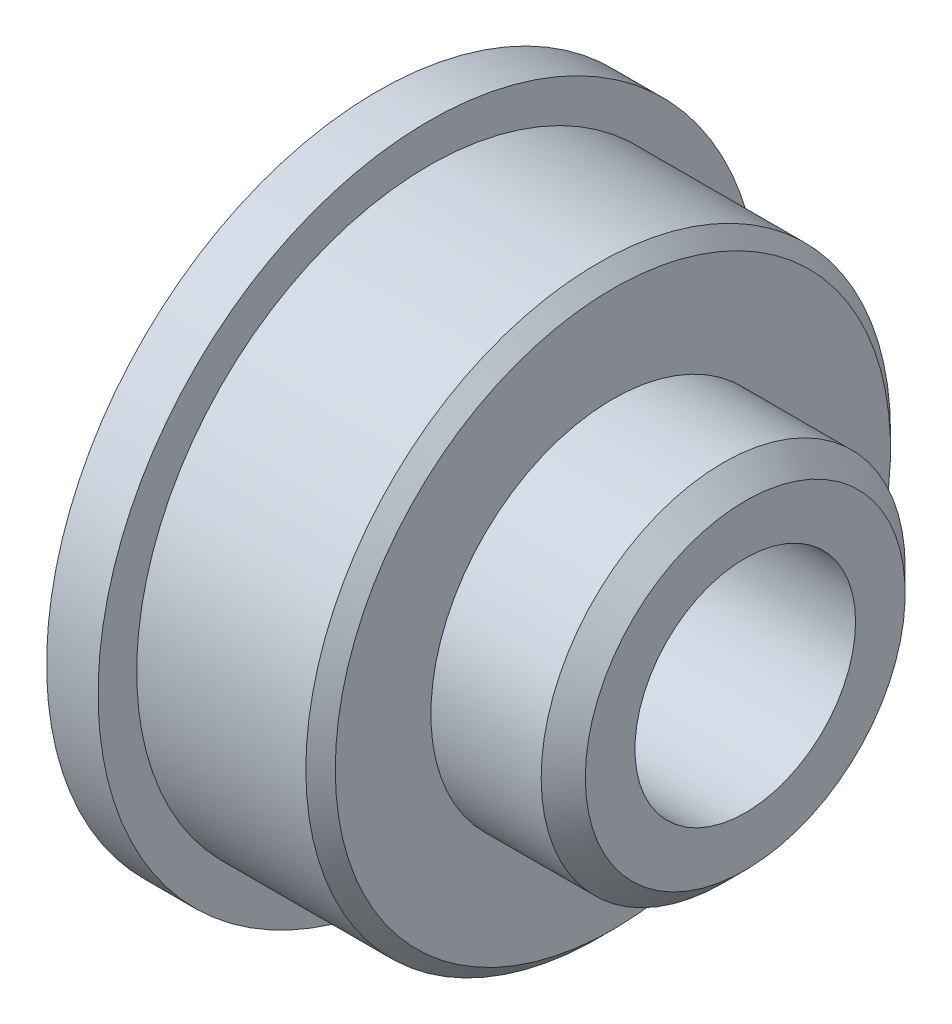
ISO-10303-21;
HEADER;
FILE_DESCRIPTION(('STEP AP214'),'2;1');
FILE_NAME('part.step','',(''),(''),'','','');
FILE_SCHEMA(('AUTOMOTIVE_DESIGN { 1 0 10303 214 1 1 1 1 }'));
ENDSEC;
DATA;
#1=APPLICATION_CONTEXT('core data for automotive mechanical design processes');
#2=APPLICATION_PROTOCOL_DEFINITION('international standard','automotive_design',2000,#1);
#3=PRODUCT_CONTEXT('',#1,'mechanical');
#4=PRODUCT('Part','Part','',(#3));
#5=PRODUCT_RELATED_PRODUCT_CATEGORY('part','',(#4));
#6=PRODUCT_DEFINITION_FORMATION('','',#4);
#7=PRODUCT_DEFINITION_CONTEXT('part definition',#1,'design');
#8=PRODUCT_DEFINITION('design','',#6,#7);
#9=PRODUCT_DEFINITION_SHAPE('','',#8);
#10=(LENGTH_UNIT() NAMED_UNIT(*) SI_UNIT(.MILLI.,.METRE.));
#11=(NAMED_UNIT(*) PLANE_ANGLE_UNIT() SI_UNIT($,.RADIAN.));
#12=(NAMED_UNIT(*) SI_UNIT($,.STERADIAN.) SOLID_ANGLE_UNIT());
#13=UNCERTAINTY_MEASURE_WITH_UNIT(LENGTH_MEASURE(1.E-05),#10,'distance_accuracy_value','');
#14=(GEOMETRIC_REPRESENTATION_CONTEXT(3) GLOBAL_UNCERTAINTY_ASSIGNED_CONTEXT((#13)) GLOBAL_UNIT_ASSIGNED_CONTEXT((#10,
#11,#12)) REPRESENTATION_CONTEXT('',''));
#15=CARTESIAN_POINT('',(0.,0.,0.));
#16=DIRECTION('',(0.,0.,1.));
#17=DIRECTION('',(1.,0.,0.));
#18=AXIS2_PLACEMENT_3D('',#15,#16,#17);
#19=CARTESIAN_POINT('',(-0.25,0.,0.));
#20=DIRECTION('',(1.,0.,0.));
#21=DIRECTION('',(0.,0.,-1.));
#22=AXIS2_PLACEMENT_3D('',#19,#20,#21);
#23=CYLINDRICAL_SURFACE('',#22,2.475);
#24=CARTESIAN_POINT('',(3.2,0.,0.));
#25=DIRECTION('',(1.,0.,0.));
#26=DIRECTION('',(0.,0.,-1.));
#27=AXIS2_PLACEMENT_3D('',#24,#25,#26);
#28=CIRCLE('',#27,2.475);
#29=CARTESIAN_POINT('',(3.2,0.,-2.475));
#30=VERTEX_POINT('',#29);
#31=EDGE_CURVE('E140',#30,#30,#28,.F.);
#32=ORIENTED_EDGE('',*,*,#31,.F.);
#33=EDGE_LOOP('',(#32));
#34=FACE_BOUND('',#33,.T.);
#35=CARTESIAN_POINT('',(4.70000011461025,0.,0.));
#36=DIRECTION('',(-1.,0.,0.));
#37=DIRECTION('',(0.,0.,-1.));
#38=AXIS2_PLACEMENT_3D('',#35,#36,#37);
#39=CIRCLE('',#38,2.47500053365002);
#40=CARTESIAN_POINT('',(4.70000011461025,0.,-2.47500053365002));
#41=VERTEX_POINT('',#40);
#42=EDGE_CURVE('E142',#41,#41,#39,.F.);
#43=ORIENTED_EDGE('',*,*,#42,.F.);
#44=EDGE_LOOP('',(#43));
#45=FACE_BOUND('',#44,.T.);
#46=ADVANCED_FACE('F16',(#34,#45),#23,.T.);
#47=CARTESIAN_POINT('',(4.70000011466709,0.,0.));
#48=DIRECTION('',(-1.,0.,0.));
#49=DIRECTION('',(0.,0.,1.));
#50=AXIS2_PLACEMENT_3D('',#47,#48,#49);
#51=CONICAL_SURFACE('',#50,2.47500053353633,0.785398294326619);
#52=CARTESIAN_POINT('',(5.00000046679361,0.,0.));
#53=DIRECTION('',(-1.,0.,0.));
#54=DIRECTION('',(0.,0.,1.));
#55=AXIS2_PLACEMENT_3D('',#52,#53,#54);
#56=CIRCLE('',#55,2.17500010285221);
#57=CARTESIAN_POINT('',(5.00000046679361,0.,2.17500010285221));
#58=VERTEX_POINT('',#57);
#59=EDGE_CURVE('E137',#58,#58,#56,.F.);
#60=ORIENTED_EDGE('',*,*,#59,.F.);
#61=EDGE_LOOP('',(#60));
#62=FACE_BOUND('',#61,.T.);
#63=ORIENTED_EDGE('',*,*,#42,.T.);
#64=EDGE_LOOP('',(#63));
#65=FACE_BOUND('',#64,.T.);
#66=ADVANCED_FACE('F82',(#62,#65),#51,.T.);
#67=CARTESIAN_POINT('',(3.2,0.,0.));
#68=DIRECTION('',(1.,0.,0.));
#69=DIRECTION('',(0.,0.,-1.));
#70=AXIS2_PLACEMENT_3D('',#67,#68,#69);
#71=PLANE('',#70);
#72=ORIENTED_EDGE('',*,*,#31,.T.);
#73=EDGE_LOOP('',(#72));
#74=FACE_BOUND('',#73,.T.);
#75=CARTESIAN_POINT('',(3.2000003816961,0.,0.));
#76=DIRECTION('',(-1.,0.,0.));
#77=DIRECTION('',(0.,0.,1.));
#78=AXIS2_PLACEMENT_3D('',#75,#76,#77);
#79=CIRCLE('',#78,3.77499995704511);
#80=CARTESIAN_POINT('',(3.2000003816961,0.,3.77499995704511));
#81=VERTEX_POINT('',#80);
#82=EDGE_CURVE('E134',#81,#81,#79,.T.);
#83=ORIENTED_EDGE('',*,*,#82,.F.);
#84=EDGE_LOOP('',(#83));
#85=FACE_BOUND('',#84,.T.);
#86=ADVANCED_FACE('F79',(#74,#85),#71,.T.);
#87=CARTESIAN_POINT('',(5.,0.,0.));
#88=DIRECTION('',(1.,0.,0.));
#89=DIRECTION('',(0.,0.,-1.));
#90=AXIS2_PLACEMENT_3D('',#87,#88,#89);
#91=PLANE('',#90);
#92=CARTESIAN_POINT('',(5.,0.,0.));
#93=DIRECTION('',(1.,0.,0.));
#94=DIRECTION('',(0.,0.,-1.));
#95=AXIS2_PLACEMENT_3D('',#92,#93,#94);
#96=CIRCLE('',#95,1.5);
#97=CARTESIAN_POINT('',(5.,0.,-1.5));
#98=VERTEX_POINT('',#97);
#99=EDGE_CURVE('E131',#98,#98,#96,.F.);
#100=ORIENTED_EDGE('',*,*,#99,.T.);
#101=EDGE_LOOP('',(#100));
#102=FACE_BOUND('',#101,.T.);
#103=ORIENTED_EDGE('',*,*,#59,.T.);
#104=EDGE_LOOP('',(#103));
#105=FACE_BOUND('',#104,.T.);
#106=ADVANCED_FACE('F75',(#102,#105),#91,.T.);
#107=CARTESIAN_POINT('',(2.99999995269218,0.,0.));
#108=DIRECTION('',(-1.,0.,0.));
#109=DIRECTION('',(0.,0.,1.));
#110=AXIS2_PLACEMENT_3D('',#107,#108,#109);
#111=CONICAL_SURFACE('',#110,3.97500040401155,0.785398208303651);
#112=CARTESIAN_POINT('',(2.999999548282,0.,0.));
#113=DIRECTION('',(1.,0.,0.));
#114=DIRECTION('',(0.,0.,-1.));
#115=AXIS2_PLACEMENT_3D('',#112,#113,#114);
#116=CIRCLE('',#115,3.975);
#117=CARTESIAN_POINT('',(2.999999548282,0.,-3.975));
#118=VERTEX_POINT('',#117);
#119=EDGE_CURVE('E130',#118,#118,#116,.F.);
#120=ORIENTED_EDGE('',*,*,#119,.F.);
#121=EDGE_LOOP('',(#120));
#122=FACE_BOUND('',#121,.T.);
#123=ORIENTED_EDGE('',*,*,#82,.T.);
#124=EDGE_LOOP('',(#123));
#125=FACE_BOUND('',#124,.T.);
#126=ADVANCED_FACE('F71',(#122,#125),#111,.T.);
#127=CARTESIAN_POINT('',(5.,0.,0.));
#128=DIRECTION('',(1.,0.,0.));
#129=DIRECTION('',(0.,0.,-1.));
#130=AXIS2_PLACEMENT_3D('',#127,#128,#129);
#131=CYLINDRICAL_SURFACE('',#130,1.5);
#132=ORIENTED_EDGE('',*,*,#99,.F.);
#133=EDGE_LOOP('',(#132));
#134=FACE_BOUND('',#133,.T.);
#135=CARTESIAN_POINT('',(2.,0.,0.));
#136=DIRECTION('',(1.,0.,0.));
#137=DIRECTION('',(0.,0.,-1.));
#138=AXIS2_PLACEMENT_3D('',#135,#136,#137);
#139=CIRCLE('',#138,1.5);
#140=CARTESIAN_POINT('',(2.,0.,-1.5));
#141=VERTEX_POINT('',#140);
#142=EDGE_CURVE('E127',#141,#141,#139,.T.);
#143=ORIENTED_EDGE('',*,*,#142,.F.);
#144=EDGE_LOOP('',(#143));
#145=FACE_BOUND('',#144,.T.);
#146=ADVANCED_FACE('F67',(#134,#145),#131,.F.);
#147=CARTESIAN_POINT('',(1.,0.,0.));
#148=DIRECTION('',(1.,0.,0.));
#149=DIRECTION('',(0.,0.,-1.));
#150=AXIS2_PLACEMENT_3D('',#147,#148,#149);
#151=CYLINDRICAL_SURFACE('',#150,3.975);
#152=CARTESIAN_POINT('',(0.7,0.,0.));
#153=DIRECTION('',(1.,0.,0.));
#154=DIRECTION('',(0.,0.,-1.));
#155=AXIS2_PLACEMENT_3D('',#152,#153,#154);
#156=CIRCLE('',#155,3.975);
#157=CARTESIAN_POINT('',(0.7,0.,-3.975));
#158=VERTEX_POINT('',#157);
#159=EDGE_CURVE('E45',#158,#158,#156,.F.);
#160=ORIENTED_EDGE('',*,*,#159,.F.);
#161=EDGE_LOOP('',(#160));
#162=FACE_BOUND('',#161,.T.);
#163=ORIENTED_EDGE('',*,*,#119,.T.);
#164=EDGE_LOOP('',(#163));
#165=FACE_BOUND('',#164,.T.);
#166=ADVANCED_FACE('F62',(#162,#165),#151,.T.);
#167=CARTESIAN_POINT('',(2.,0.,0.));
#168=DIRECTION('',(-1.,0.,0.));
#169=DIRECTION('',(0.,0.,1.));
#170=AXIS2_PLACEMENT_3D('',#167,#168,#169);
#171=PLANE('',#170);
#172=ORIENTED_EDGE('',*,*,#142,.T.);
#173=EDGE_LOOP('',(#172));
#174=FACE_BOUND('',#173,.T.);
#175=CARTESIAN_POINT('',(2.,0.,0.));
#176=DIRECTION('',(1.,0.,0.));
#177=DIRECTION('',(0.,0.,1.));
#178=AXIS2_PLACEMENT_3D('',#175,#176,#177);
#179=CIRCLE('',#178,2.499999993199);
#180=CARTESIAN_POINT('',(2.,0.,-2.4999999938791));
#181=VERTEX_POINT('',#180);
#182=CARTESIAN_POINT('',(2.,0.,2.4999999938791));
#183=VERTEX_POINT('',#182);
#184=EDGE_CURVE('E35',#181,#183,#179,.F.);
#185=ORIENTED_EDGE('',*,*,#184,.T.);
#186=CARTESIAN_POINT('',(2.,0.,-2.499999993199));
#187=CARTESIAN_POINT('',(1.99999999899755,0.02994437348333,-2.49998754850958));
#188=CARTESIAN_POINT('',(1.99999999917553,0.0598884759613711,-2.49944358580543));
#189=CARTESIAN_POINT('',(1.99999999983409,0.119737851648341,-2.49729431455899));
#190=CARTESIAN_POINT('',(2.00000000031465,0.149643125768906,-2.4956890314036));
#191=CARTESIAN_POINT('',(1.99999999952022,0.209377781375488,-2.49141882385988));
#192=CARTESIAN_POINT('',(1.99999999824524,0.239207163399181,-2.48875390699992));
#193=CARTESIAN_POINT('',(1.99999998407892,0.298752705675402,-2.48236826012512));
#194=CARTESIAN_POINT('',(1.99999997118746,0.328468864825793,-2.47864751985914));
#195=CARTESIAN_POINT('',(1.99999992068372,0.387752269106427,-2.47015330087643));
#196=CARTESIAN_POINT('',(1.99999988307077,0.417319510266267,-2.46537979424157));
#197=CARTESIAN_POINT('',(1.99999980386705,0.454159524143739,-2.45876225109476));
#198=CARTESIAN_POINT('',(1.99999978641582,0.46152198085021,-2.45740613163128));
#199=CARTESIAN_POINT('',(1.99999971538029,0.490913527739357,-2.45185328114006));
#200=CARTESIAN_POINT('',(1.99999965918308,0.51289266733521,-2.44738816401019));
#201=CARTESIAN_POINT('',(1.99999955666461,0.564021920217372,-2.43625934931284));
#202=CARTESIAN_POINT('',(1.99999951987681,0.593120651105989,-2.4293588720839));
#203=CARTESIAN_POINT('',(1.99999950530884,0.651042371778675,-2.41449033714394));
#204=CARTESIAN_POINT('',(1.9999995275255,0.679865376265368,-2.40652233670054));
#205=CARTESIAN_POINT('',(1.99999962031393,0.737192997924818,-2.38952383872568));
#206=CARTESIAN_POINT('',(1.99999969088132,0.765697643730225,-2.3804934376012));
#207=CARTESIAN_POINT('',(1.9999998404254,0.822357495246444,-2.36140291050145));
#208=CARTESIAN_POINT('',(1.99999991940102,0.850512745125127,-2.35134291619708));
#209=CARTESIAN_POINT('',(1.99999998490283,0.89243173866375,-2.33543559645305));
#210=CARTESIAN_POINT('',(1.99999999791033,0.906351897549759,-2.32999715836867));
#211=CARTESIAN_POINT('',(2.00000000080072,0.925557206761715,-2.32235312406769));
#212=CARTESIAN_POINT('',(1.99999999999839,0.930872461272239,-2.32022258471636));
#213=CARTESIAN_POINT('',(1.99999999709115,0.960646722560501,-2.30818350948904));
#214=CARTESIAN_POINT('',(2.00000000073309,0.98497508539434,-2.2979502075747));
#215=CARTESIAN_POINT('',(1.9999999858742,1.05811418445536,-2.26581184034101));
#216=CARTESIAN_POINT('',(1.99999994079227,1.10640917285178,-2.24271298326947));
#217=CARTESIAN_POINT('',(1.99999981083055,1.18225698790791,-2.20340326289109));
#218=CARTESIAN_POINT('',(1.99999974932045,1.21032310789705,-2.18816945622465));
#219=CARTESIAN_POINT('',(1.99999963128831,1.26586696863462,-2.15660956663702));
#220=CARTESIAN_POINT('',(1.99999957477023,1.29334422974294,-2.14028263487698));
#221=CARTESIAN_POINT('',(1.99999951413848,1.33815223293122,-2.11245865770479));
#222=CARTESIAN_POINT('',(1.99999949861483,1.35567400101495,-2.10126705428876));
#223=CARTESIAN_POINT('',(1.99999947763739,1.40691072666157,-2.06761757289847));
#224=CARTESIAN_POINT('',(1.99999949569659,1.4402232154905,-2.04454113885735));
#225=CARTESIAN_POINT('',(1.99999955737906,1.49912691344765,-2.00156150901813));
#226=CARTESIAN_POINT('',(1.99999959516662,1.52492978802529,-1.98194682122859));
#227=CARTESIAN_POINT('',(1.99999968588082,1.57574076610722,-1.94171618313286));
#228=CARTESIAN_POINT('',(1.99999973880641,1.60074892443928,-1.92110030214853));
#229=CARTESIAN_POINT('',(1.9999998441869,1.6499410509873,-1.87891142573003));
#230=CARTESIAN_POINT('',(1.99999989664182,1.67412509036446,-1.85733851330599));
#231=CARTESIAN_POINT('',(1.99999997150062,1.72159364586717,-1.81322986770348));
#232=CARTESIAN_POINT('',(1.99999999390761,1.74487825527961,-1.79069423488961));
#233=CARTESIAN_POINT('',(2.00000000334782,1.78034447487137,-1.75516821379989));
#234=CARTESIAN_POINT('',(2.00000000176929,1.79280245087729,-1.74245121587127));
#235=CARTESIAN_POINT('',(1.99999999628169,1.83007623278986,-1.70360771994764));
#236=CARTESIAN_POINT('',(1.9999999916414,1.85448280317823,-1.67708513084569));
#237=CARTESIAN_POINT('',(1.99999994644317,1.89931823815959,-1.62620392830723));
#238=CARTESIAN_POINT('',(1.9999999101883,1.91987662629108,-1.60195928616996));
#239=CARTESIAN_POINT('',(1.99999983924467,1.94890493450316,-1.56637353727422));
#240=CARTESIAN_POINT('',(1.99999981485225,1.95775197752427,-1.55533824461054));
#241=CARTESIAN_POINT('',(1.99999972812999,1.98777723617055,-1.51722121855563));
#242=CARTESIAN_POINT('',(1.99999966145083,2.0084891040219,-1.48976943874379));
#243=CARTESIAN_POINT('',(1.99999955084309,2.04978098754341,-1.43258755230399));
#244=CARTESIAN_POINT('',(1.99999950826229,2.07029933539294,-1.40281290735654));
#245=CARTESIAN_POINT('',(1.99999948742548,2.10349409182909,-1.35228565596228));
#246=CARTESIAN_POINT('',(1.99999949266631,2.11653742243658,-1.3317729570516));
#247=CARTESIAN_POINT('',(1.99999951901824,2.14626044546839,-1.28347300368249));
#248=CARTESIAN_POINT('',(1.999999544836,2.16270345010737,-1.25553951614693));
#249=CARTESIAN_POINT('',(1.99999961793599,2.19447655746322,-1.19904939517711));
#250=CARTESIAN_POINT('',(1.99999966521694,2.20980672693502,-1.17049279925472));
#251=CARTESIAN_POINT('',(1.99999976657829,2.23933101783434,-1.11280118160876));
#252=CARTESIAN_POINT('',(1.99999982065817,2.25352522709571,-1.08366620482415));
#253=CARTESIAN_POINT('',(1.99999991678013,2.28075726578496,-1.02486307752375));
#254=CARTESIAN_POINT('',(1.99999995882334,2.29379520466172,-0.995194977792083));
#255=CARTESIAN_POINT('',(1.99999999327376,2.31246509958405,-0.950327110824712));
#256=CARTESIAN_POINT('',(1.9999999999883,2.31854046772765,-0.935310457578597));
#257=CARTESIAN_POINT('',(2.00000000001081,2.32995108442519,-0.906306751910313));
#258=CARTESIAN_POINT('',(1.99999999429731,2.33530751415768,-0.892328025551553));
#259=CARTESIAN_POINT('',(1.99999997235397,2.35101203498216,-0.850258851914034));
#260=CARTESIAN_POINT('',(1.99999995132107,2.36099685723896,-0.822031781149041));
#261=CARTESIAN_POINT('',(1.99999993427339,2.37997670860666,-0.765250350320777));
#262=CARTESIAN_POINT('',(1.99999993825641,2.38897182457741,-0.736696019222195));
#263=CARTESIAN_POINT('',(1.99999995888001,2.40596909727699,-0.679294209331176));
#264=CARTESIAN_POINT('',(1.99999997552003,2.4139712975215,-0.650446743445703));
#265=CARTESIAN_POINT('',(2.00000001264168,2.42895351069978,-0.592488262506381));
#266=CARTESIAN_POINT('',(2.00000003312332,2.43593352348128,-0.563377247413274));
#267=CARTESIAN_POINT('',(1.99999989770249,2.44731126214643,-0.512245027124484));
#268=CARTESIAN_POINT('',(1.99999978460879,2.45191834801872,-0.490270486564638));
#269=CARTESIAN_POINT('',(1.99999968356455,2.46034881439099,-0.446542936461669));
#270=CARTESIAN_POINT('',(1.99999969360474,2.46418374256304,-0.424792152294458));
#271=CARTESIAN_POINT('',(1.99999974150468,2.47374123316725,-0.365995125938665));
#272=CARTESIAN_POINT('',(1.99999979388041,2.47891559471016,-0.3288583232431));
#273=CARTESIAN_POINT('',(1.99999986182999,2.4853933666941,-0.273153526369679));
#274=CARTESIAN_POINT('',(1.99999988265044,2.4873335952782,-0.254656975557155));
#275=CARTESIAN_POINT('',(1.99999992776086,2.49159039375756,-0.209193970386145));
#276=CARTESIAN_POINT('',(1.99999994931439,2.49367610075623,-0.182205501212417));
#277=CARTESIAN_POINT('',(1.99999998344263,2.49730416889545,-0.122732223571729));
#278=CARTESIAN_POINT('',(1.99999999333409,2.49865244819534,-0.0902353581461192));
#279=CARTESIAN_POINT('',(1.99999999962748,2.49980069600128,-0.0384872590678403));
#280=CARTESIAN_POINT('',(1.99999999988758,2.50000801925039,-0.0192438533998434));
#281=CARTESIAN_POINT('',(2.00000000017488,2.49998750815051,0.0299350740666117));
#282=CARTESIAN_POINT('',(1.99999999999241,2.49945392431776,0.0598712315475667));
#283=CARTESIAN_POINT('',(2.00000000000412,2.49731825587499,0.119704357884078));
#284=CARTESIAN_POINT('',(2.00000000019829,2.49571618914449,0.149601327387002));
#285=CARTESIAN_POINT('',(1.99999999591325,2.4914532139093,0.209319893273983));
#286=CARTESIAN_POINT('',(1.99999999143404,2.48879230762532,0.239141489815989));
#287=CARTESIAN_POINT('',(1.99999997145443,2.48241159331049,0.298670860291309));
#288=CARTESIAN_POINT('',(1.99999995595389,2.47869177200374,0.328378632792848));
#289=CARTESIAN_POINT('',(1.99999988482504,2.46914302236818,0.395055077342528));
#290=CARTESIAN_POINT('',(1.9999998201335,2.46301930537614,0.431982215965687));
#291=CARTESIAN_POINT('',(1.99999968473941,2.45189916202744,0.490792605913764));
#292=CARTESIAN_POINT('',(1.99999962682082,2.4474335019622,0.512777810086265));
#293=CARTESIAN_POINT('',(1.9999995253552,2.43630104642702,0.563921534849423));
#294=CARTESIAN_POINT('',(1.99999949303076,2.42939667470185,0.593028832177501));
#295=CARTESIAN_POINT('',(1.99999948654387,2.41452123633511,0.650967249315592));
#296=CARTESIAN_POINT('',(1.99999951237799,2.40655023271786,0.679798385335436));
#297=CARTESIAN_POINT('',(1.99999961164119,2.38954540241413,0.737142121403031));
#298=CARTESIAN_POINT('',(1.99999968506572,2.38051167733809,0.765654751619238));
#299=CARTESIAN_POINT('',(1.99999983855624,2.36141456697115,0.822330397812657));
#300=CARTESIAN_POINT('',(1.99999991862134,2.3513513177655,0.850493459446359));
#301=CARTESIAN_POINT('',(1.9999999848172,2.33543892194829,0.892424048316784));
#302=CARTESIAN_POINT('',(1.99999999789941,2.32999876802083,0.906348032016462));
#303=CARTESIAN_POINT('',(2.00000000080406,2.32235475171186,0.925553048992837));
#304=CARTESIAN_POINT('',(1.99999999999911,2.32022588292227,0.930864162673808));
#305=CARTESIAN_POINT('',(1.99999999707889,2.30818959831436,0.960631902584609));
#306=CARTESIAN_POINT('',(2.00000000073064,2.29795749473566,0.984957918337181));
#307=CARTESIAN_POINT('',(1.9999999858946,2.26581797271558,1.05810138372219));
#308=CARTESIAN_POINT('',(1.99999994080478,2.24271624735748,1.10640287871383));
#309=CARTESIAN_POINT('',(1.99999981082952,2.2034032616424,1.18225698799243));
#310=CARTESIAN_POINT('',(1.99999974932018,2.18816945603289,1.21032310766603));
#311=CARTESIAN_POINT('',(1.99999963128859,2.15660956723369,1.26586696815405));
#312=CARTESIAN_POINT('',(1.99999957477029,2.14028263519808,1.29334422932511));
#313=CARTESIAN_POINT('',(1.99999951413844,2.11245865781898,1.33815223268225));
#314=CARTESIAN_POINT('',(1.99999949861482,2.10126705435534,1.35567400089008));
#315=CARTESIAN_POINT('',(1.99999947763742,2.06761757293251,1.40691072665573));
#316=CARTESIAN_POINT('',(1.9999994956966,2.04454113886613,1.44022321548942));
#317=CARTESIAN_POINT('',(1.99999955737906,2.00156150901269,1.49912691344952));
#318=CARTESIAN_POINT('',(1.99999959516662,1.98194682122797,1.52492978802647));
#319=CARTESIAN_POINT('',(1.99999968588082,1.94171618313567,1.57574076610775));
#320=CARTESIAN_POINT('',(1.99999973880641,1.92110030214995,1.60074892443984));
#321=CARTESIAN_POINT('',(1.9999998441869,1.8789114257306,1.6499410509885));
#322=CARTESIAN_POINT('',(1.99999989664182,1.85733851330708,1.67412509036626));
#323=CARTESIAN_POINT('',(1.99999997150062,1.81322986770364,1.72159364586659));
#324=CARTESIAN_POINT('',(1.99999999390761,1.7906942348883,1.74487825527606));
#325=CARTESIAN_POINT('',(2.00000000334782,1.75516821379908,1.78034447487485));
#326=CARTESIAN_POINT('',(2.00000000176929,1.74245121587046,1.79280245088618));
#327=CARTESIAN_POINT('',(1.99999999628169,1.70360771993821,1.83007623278166));
#328=CARTESIAN_POINT('',(1.9999999916414,1.67708513081538,1.8544828031168));
#329=CARTESIAN_POINT('',(1.99999994644317,1.6262039283275,1.89931823821911));
#330=CARTESIAN_POINT('',(1.9999999101883,1.60195928625122,1.91987662649862));
#331=CARTESIAN_POINT('',(1.99999983924467,1.56637353727687,1.94890493437917));
#332=CARTESIAN_POINT('',(1.99999981485224,1.55533824458835,1.9577519772064));
#333=CARTESIAN_POINT('',(1.99999972813,1.51722121896654,1.98777723666235));
#334=CARTESIAN_POINT('',(1.99999966145089,1.48976944043251,2.00848910756181));
#335=CARTESIAN_POINT('',(1.99999955084303,1.43258755091798,2.04978098353987));
#336=CARTESIAN_POINT('',(1.99999950826205,1.40281290132732,2.07029932007712));
#337=CARTESIAN_POINT('',(1.99999948742563,1.35228566007446,2.10349410208927));
#338=CARTESIAN_POINT('',(1.9999994926668,1.33177297010238,2.1165374549975));
#339=CARTESIAN_POINT('',(1.99999951901758,1.28347298628262,2.14626040205806));
#340=CARTESIAN_POINT('',(1.99999954483322,1.25553944226018,2.16270326576835));
#341=CARTESIAN_POINT('',(1.99999961793877,1.19904946905978,2.19447674179288));
#342=CARTESIAN_POINT('',(1.99999966522741,1.17049307737804,2.209807420823));
#343=CARTESIAN_POINT('',(1.99999976656782,1.11280090350743,2.23933032400187));
#344=CARTESIAN_POINT('',(1.99999982061907,1.0836651663322,2.25352263617076));
#345=CARTESIAN_POINT('',(1.99999991681922,1.02486411591766,2.28075985646586));
#346=CARTESIAN_POINT('',(1.99999995896924,0.99519885312159,2.29380487319045));
#347=CARTESIAN_POINT('',(1.99999999320082,0.950325173225161,2.31246026548254));
#348=CARTESIAN_POINT('',(1.99999999977923,0.935304904425905,2.31852661321153));
#349=CARTESIAN_POINT('',(2.00000000001886,0.91894966331857,2.32497848951299));
#350=CARTESIAN_POINT('',(1.99999999999133,0.917662205997318,2.32548534096159));
#351=CARTESIAN_POINT('',(1.99999999984511,0.909895352042589,2.32853709153033));
#352=CARTESIAN_POINT('',(1.99999999980635,0.903407784823065,2.33106127778567));
#353=CARTESIAN_POINT('',(1.99999999967193,0.885191622462335,2.33806028062999));
#354=CARTESIAN_POINT('',(1.99999999955559,0.873439208281647,2.34247323233251));
#355=CARTESIAN_POINT('',(1.99999999933184,0.844620275099042,2.35304976951896));
#356=CARTESIAN_POINT('',(1.99999999925148,0.827518539887119,2.35911754415397));
#357=CARTESIAN_POINT('',(1.99999999909713,0.787896987614902,2.37269174928511));
#358=CARTESIAN_POINT('',(1.99999999903272,0.765331557420845,2.38006530531309));
#359=CARTESIAN_POINT('',(1.99999999894012,0.714660585238488,2.39582845240527));
#360=CARTESIAN_POINT('',(1.99999999892402,0.686502117560614,2.40404824225698));
#361=CARTESIAN_POINT('',(1.99999999892943,0.62451890571693,2.42096446619188));
#362=CARTESIAN_POINT('',(1.99999999895869,0.590637308950712,2.4294530382397));
#363=CARTESIAN_POINT('',(1.99999999905534,0.517096756622211,2.44624879104945));
#364=CARTESIAN_POINT('',(1.99999999912807,0.477381315382463,2.45430934273358));
#365=CARTESIAN_POINT('',(1.99999999929541,0.392100405945598,2.46946946313309));
#366=CARTESIAN_POINT('',(1.99999999939165,0.346483961648103,2.47628291930644));
#367=CARTESIAN_POINT('',(1.99999999960106,0.249391451007566,2.4880515249974));
#368=CARTESIAN_POINT('',(1.99999999971487,0.197875555261522,2.49268117506965));
#369=CARTESIAN_POINT('',(1.99999999983315,0.106440061555571,2.49804039781679));
#370=CARTESIAN_POINT('',(1.99999999985664,0.0665576363306858,2.49941898974078));
#371=CARTESIAN_POINT('',(1.99999999995481,0.0177792221995284,2.4999480093356));
#372=CARTESIAN_POINT('',(1.99999999997553,0.00888950867463398,2.49999743730381));
#373=CARTESIAN_POINT('',(2.,0.,2.499999993199));
#374=B_SPLINE_CURVE_WITH_KNOTS('',3,(#186,#187,#188,#189,#190,#191,#192,#193,#194,#195,#196,
#197,#198,#199,#200,#201,#202,#203,#204,#205,#206,#207,#208,#209,#210,#211,#212,#213,#214,#215,
#216,#217,#218,#219,#220,#221,#222,#223,#224,#225,#226,#227,#228,#229,#230,#231,#232,#233,#234,
#235,#236,#237,#238,#239,#240,#241,#242,#243,#244,#245,#246,#247,#248,#249,#250,#251,#252,#253,
#254,#255,#256,#257,#258,#259,#260,#261,#262,#263,#264,#265,#266,#267,#268,#269,#270,#271,#272,
#273,#274,#275,#276,#277,#278,#279,#280,#281,#282,#283,#284,#285,#286,#287,#288,#289,#290,#291,
#292,#293,#294,#295,#296,#297,#298,#299,#300,#301,#302,#303,#304,#305,#306,#307,#308,#309,#310,
#311,#312,#313,#314,#315,#316,#317,#318,#319,#320,#321,#322,#323,#324,#325,#326,#327,#328,#329,
#330,#331,#332,#333,#334,#335,#336,#337,#338,#339,#340,#341,#342,#343,#344,#345,#346,#347,#348,
#349,#350,#351,#352,#353,#354,#355,#356,#357,#358,#359,#360,#361,#362,#363,#364,#365,#366,#367,
#368,#369,#370,#371,#372,#373),.UNSPECIFIED.,.F.,.F.,(4,2,2,2,2,2,2,2,2,2,2,2,2,2,2,2,2,2,2,2,2,
2,2,2,2,2,2,2,2,2,2,2,2,2,2,2,2,2,2,2,2,2,2,2,2,2,2,2,2,2,2,2,2,2,2,2,2,2,2,2,2,2,2,2,2,2,2,2,2,
2,2,2,2,2,2,2,2,2,2,2,2,2,2,2,2,2,2,2,2,2,2,2,2,4),(0.,0.0898283308477543,0.179654513069366,
0.269480057114373,0.359306473318122,0.449135271899214,0.471594124320934,0.538869259640738,
0.62856566591801,0.718257262328888,0.807940725993396,0.897612734666967,0.942445316154679,
0.959624359651813,1.03879353277583,1.19926732050847,1.29505025917871,1.39090845823364,
1.45327662079058,1.5747944385948,1.67200672102711,1.76921228212316,1.86640942831442,
1.96359646621476,2.0170015502001,2.12509554563912,2.22043392446266,2.26286412921382,
2.36599766588135,2.47444004681823,2.54735608277543,2.64457096874702,2.74178001832328,
2.83898154429738,2.93617385964122,2.98476838486466,3.02967595926636,3.11947933481232,
3.20927482262386,3.29906637365258,3.38885793805647,3.4562054767514,3.52245553427745,
3.63489795702938,3.69068859279543,3.77188092233613,3.86942841638391,3.92715825786956,
4.0169608064974,4.10676185244561,4.19656271005433,4.28636469357042,4.39861743942735,
4.46591294706541,4.55563604776393,4.64535384931262,4.7350630795962,4.82476046715638,
4.86960560834103,4.8867712568974,4.96593255061963,5.12642760218704,5.22221054035828,
5.31806873945391,5.38043690246915,5.50195472027352,5.59916700270593,5.69637256380207,
5.79356970999338,5.8907567478937,5.94416183188553,6.05225582732315,6.14759420614183,
6.19002441073959,6.29315794724808,6.40160032849743,6.47451636445463,6.57173125042622,
6.66894030000246,6.76614182597652,6.8633341413203,6.91192866654369,6.91607957270358,
6.93696333607567,6.97462274713019,7.02905732914622,7.10026645043202,7.18824932466524,
7.29300501096617,7.41453241392569,7.55283028362161,7.70789721563141,7.82756817776182,
7.85423719839046),.UNSPECIFIED.);
#375=EDGE_CURVE('E33',#183,#181,#374,.F.);
#376=ORIENTED_EDGE('',*,*,#375,.T.);
#377=EDGE_LOOP('',(#185,#376));
#378=FACE_BOUND('',#377,.T.);
#379=ADVANCED_FACE('F44',(#174,#378),#171,.T.);
#380=CARTESIAN_POINT('',(0.7,0.,0.));
#381=DIRECTION('',(1.,0.,0.));
#382=DIRECTION('',(0.,0.,-1.));
#383=AXIS2_PLACEMENT_3D('',#380,#381,#382);
#384=PLANE('',#383);
#385=ORIENTED_EDGE('',*,*,#159,.T.);
#386=EDGE_LOOP('',(#385));
#387=FACE_BOUND('',#386,.T.);
#388=CARTESIAN_POINT('',(0.7,0.,0.));
#389=DIRECTION('',(1.,0.,0.));
#390=DIRECTION('',(0.,0.,-1.));
#391=AXIS2_PLACEMENT_3D('',#388,#389,#390);
#392=CIRCLE('',#391,4.5);
#393=CARTESIAN_POINT('',(0.7,0.,-4.5));
#394=VERTEX_POINT('',#393);
#395=EDGE_CURVE('E40',#394,#394,#392,.F.);
#396=ORIENTED_EDGE('',*,*,#395,.F.);
#397=EDGE_LOOP('',(#396));
#398=FACE_BOUND('',#397,.T.);
#399=ADVANCED_FACE('F61',(#387,#398),#384,.T.);
#400=CARTESIAN_POINT('',(1.7,0.,0.));
#401=DIRECTION('',(-1.,0.,0.));
#402=DIRECTION('',(0.,0.0106674693626005,0.999943100929947));
#403=AXIS2_PLACEMENT_3D('',#400,#401,#402);
#404=TOROIDAL_SURFACE('',#403,2.5,0.3);
#405=CARTESIAN_POINT('',(1.7,0.,0.));
#406=DIRECTION('',(-1.,0.,0.));
#407=DIRECTION('',(0.,0.,1.));
#408=AXIS2_PLACEMENT_3D('',#405,#406,#407);
#409=CIRCLE('',#408,2.8);
#410=CARTESIAN_POINT('',(1.7,0.,2.8));
#411=VERTEX_POINT('',#410);
#412=EDGE_CURVE('E116',#411,#411,#409,.T.);
#413=ORIENTED_EDGE('',*,*,#412,.T.);
#414=EDGE_LOOP('',(#413));
#415=FACE_BOUND('',#414,.T.);
#416=ORIENTED_EDGE('',*,*,#375,.F.);
#417=ORIENTED_EDGE('',*,*,#184,.F.);
#418=EDGE_LOOP('',(#416,#417));
#419=FACE_BOUND('',#418,.T.);
#420=ADVANCED_FACE('F37',(#415,#419),#404,.F.);
#421=CARTESIAN_POINT('',(-0.25,0.,0.));
#422=DIRECTION('',(1.,0.,0.));
#423=DIRECTION('',(0.,0.,-1.));
#424=AXIS2_PLACEMENT_3D('',#421,#422,#423);
#425=CYLINDRICAL_SURFACE('',#424,4.5);
#426=ORIENTED_EDGE('',*,*,#395,.T.);
#427=EDGE_LOOP('',(#426));
#428=FACE_BOUND('',#427,.T.);
#429=CARTESIAN_POINT('',(0.,0.,0.));
#430=DIRECTION('',(1.,0.,0.));
#431=DIRECTION('',(0.,0.,-1.));
#432=AXIS2_PLACEMENT_3D('',#429,#430,#431);
#433=CIRCLE('',#432,4.5);
#434=CARTESIAN_POINT('',(0.,0.,-4.5));
#435=VERTEX_POINT('',#434);
#436=EDGE_CURVE('E26',#435,#435,#433,.T.);
#437=ORIENTED_EDGE('',*,*,#436,.T.);
#438=EDGE_LOOP('',(#437));
#439=FACE_BOUND('',#438,.T.);
#440=ADVANCED_FACE('F101',(#428,#439),#425,.T.);
#441=CARTESIAN_POINT('',(0.,0.,0.));
#442=DIRECTION('',(-1.,0.,0.));
#443=DIRECTION('',(0.,0.,1.));
#444=AXIS2_PLACEMENT_3D('',#441,#442,#443);
#445=CYLINDRICAL_SURFACE('',#444,2.8);
#446=CARTESIAN_POINT('',(0.,0.,0.));
#447=DIRECTION('',(-1.,0.,0.));
#448=DIRECTION('',(0.,0.,1.));
#449=AXIS2_PLACEMENT_3D('',#446,#447,#448);
#450=CIRCLE('',#449,2.8);
#451=CARTESIAN_POINT('',(0.,0.,2.8));
#452=VERTEX_POINT('',#451);
#453=EDGE_CURVE('E10',#452,#452,#450,.T.);
#454=ORIENTED_EDGE('',*,*,#453,.T.);
#455=EDGE_LOOP('',(#454));
#456=FACE_BOUND('',#455,.T.);
#457=ORIENTED_EDGE('',*,*,#412,.F.);
#458=EDGE_LOOP('',(#457));
#459=FACE_BOUND('',#458,.T.);
#460=ADVANCED_FACE('F95',(#456,#459),#445,.F.);
#461=CARTESIAN_POINT('',(0.,0.,0.));
#462=DIRECTION('',(1.,0.,0.));
#463=DIRECTION('',(0.,0.,-1.));
#464=AXIS2_PLACEMENT_3D('',#461,#462,#463);
#465=PLANE('',#464);
#466=ORIENTED_EDGE('',*,*,#453,.F.);
#467=EDGE_LOOP('',(#466));
#468=FACE_BOUND('',#467,.T.);
#469=ORIENTED_EDGE('',*,*,#436,.F.);
#470=EDGE_LOOP('',(#469));
#471=FACE_BOUND('',#470,.T.);
#472=ADVANCED_FACE('F93',(#468,#471),#465,.F.);
#473=CLOSED_SHELL('',(#46,#66,#86,#106,#126,#146,#166,#379,#399,#420,#440,#460,#472));
#474=MANIFOLD_SOLID_BREP('B1',#473);
#475=ADVANCED_BREP_SHAPE_REPRESENTATION('',(#18,#474),#14);
#476=SHAPE_DEFINITION_REPRESENTATION(#9,#475);
ENDSEC;
END-ISO-10303-21;
